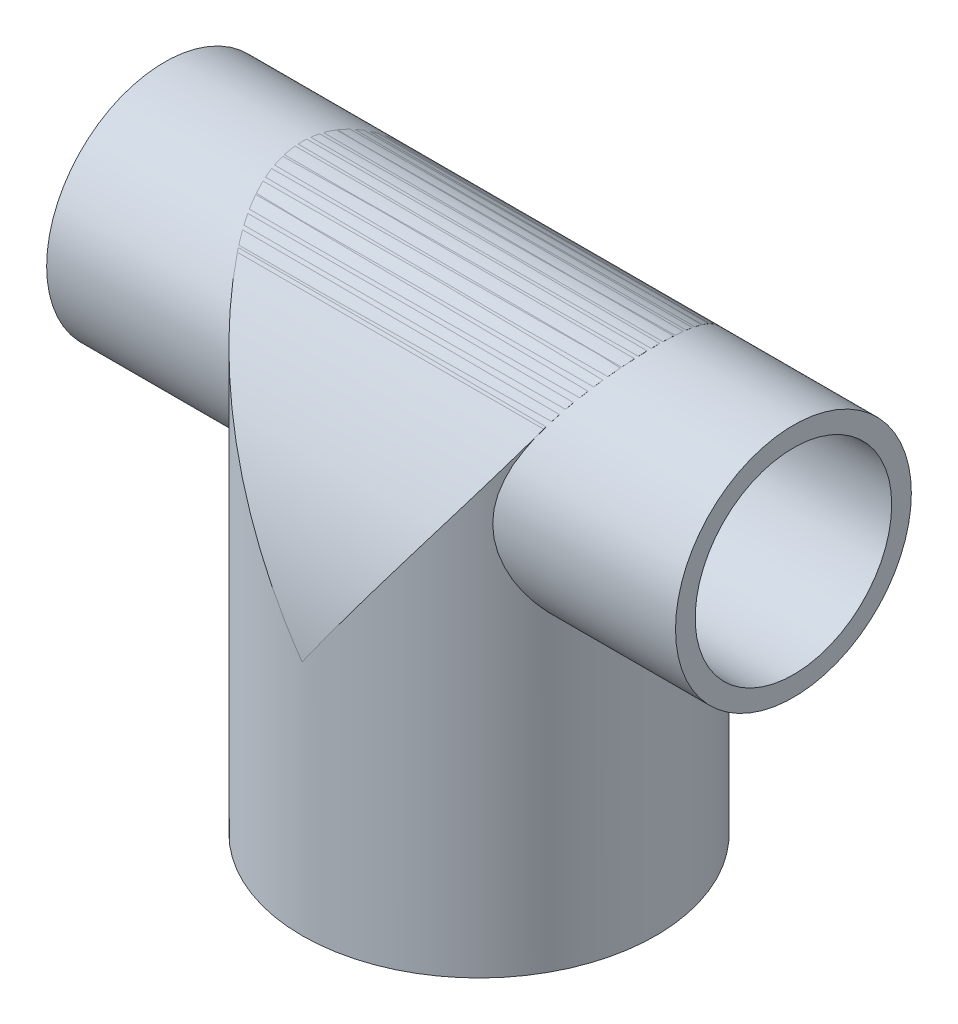
ISO-10303-21;
HEADER;
FILE_DESCRIPTION(('STEP AP214'),'2;1');
FILE_NAME('part.step','',(''),(''),'','','');
FILE_SCHEMA(('AUTOMOTIVE_DESIGN { 1 0 10303 214 1 1 1 1 }'));
ENDSEC;
DATA;
#1=APPLICATION_CONTEXT('core data for automotive mechanical design processes');
#2=APPLICATION_PROTOCOL_DEFINITION('international standard','automotive_design',2000,#1);
#3=PRODUCT_CONTEXT('',#1,'mechanical');
#4=PRODUCT('Part','Part','',(#3));
#5=PRODUCT_RELATED_PRODUCT_CATEGORY('part','',(#4));
#6=PRODUCT_DEFINITION_FORMATION('','',#4);
#7=PRODUCT_DEFINITION_CONTEXT('part definition',#1,'design');
#8=PRODUCT_DEFINITION('design','',#6,#7);
#9=PRODUCT_DEFINITION_SHAPE('','',#8);
#10=(LENGTH_UNIT() NAMED_UNIT(*) SI_UNIT(.MILLI.,.METRE.));
#11=(NAMED_UNIT(*) PLANE_ANGLE_UNIT() SI_UNIT($,.RADIAN.));
#12=(NAMED_UNIT(*) SI_UNIT($,.STERADIAN.) SOLID_ANGLE_UNIT());
#13=UNCERTAINTY_MEASURE_WITH_UNIT(LENGTH_MEASURE(1.E-05),#10,'distance_accuracy_value','');
#14=(GEOMETRIC_REPRESENTATION_CONTEXT(3) GLOBAL_UNCERTAINTY_ASSIGNED_CONTEXT((#13)) GLOBAL_UNIT_ASSIGNED_CONTEXT((#10,
#11,#12)) REPRESENTATION_CONTEXT('',''));
#15=CARTESIAN_POINT('',(0.,0.,0.));
#16=DIRECTION('',(0.,0.,1.));
#17=DIRECTION('',(1.,0.,0.));
#18=AXIS2_PLACEMENT_3D('',#15,#16,#17);
#19=CARTESIAN_POINT('',(0.,-20.,0.));
#20=DIRECTION('',(0.,1.,0.));
#21=DIRECTION('',(0.,0.,1.));
#22=AXIS2_PLACEMENT_3D('',#19,#20,#21);
#23=CYLINDRICAL_SURFACE('',#22,9.);
#24=CARTESIAN_POINT('',(-7.79422863405995,3.96862696659689,4.5));
#25=CARTESIAN_POINT('',(-7.70308478184273,3.78964083789323,4.65784763940967));
#26=CARTESIAN_POINT('',(-7.60819275088141,3.60863949449058,4.8111511341147));
#27=CARTESIAN_POINT('',(-7.41164547929331,3.24302832958497,5.10875105911939));
#28=CARTESIAN_POINT('',(-7.30999202475322,3.05841947006575,5.25304984871991));
#29=CARTESIAN_POINT('',(-6.9962917563528,2.50034413699761,5.67217649545327));
#30=CARTESIAN_POINT('',(-6.77517067294804,2.12197968729555,5.93380384000888));
#31=CARTESIAN_POINT('',(-6.31420796583351,1.35602069142892,6.42209221595486));
#32=CARTESIAN_POINT('',(-6.07441093807441,0.968449581207782,6.6488329167972));
#33=CARTESIAN_POINT('',(-5.5793677589183,0.185101532789707,7.06938278733877));
#34=CARTESIAN_POINT('',(-5.32411238146085,-0.210680211285928,7.26317202250611));
#35=CARTESIAN_POINT('',(-4.67498984183713,-1.20164067522943,7.70484117242372));
#36=CARTESIAN_POINT('',(-4.27381182104502,-1.80064353028685,7.93352666621431));
#37=CARTESIAN_POINT('',(-3.45318694729272,-3.00811989259021,8.32357916668871));
#38=CARTESIAN_POINT('',(-3.03373135366311,-3.61659783959887,8.48491356585856));
#39=CARTESIAN_POINT('',(-2.18371679891725,-4.83897015241524,8.74233911157039));
#40=CARTESIAN_POINT('',(-1.75316340915755,-5.45286170241634,8.83846235809987));
#41=CARTESIAN_POINT('',(-0.886838404548188,-6.68304899013658,8.96688489209103));
#42=CARTESIAN_POINT('',(-0.451071421129557,-7.29934230733734,8.99923712687785));
#43=CARTESIAN_POINT('',(-0.0103279263125402,-7.92264803923967,8.9999955528161));
#44=CARTESIAN_POINT('',(-0.00516394750381054,-7.92995100809319,8.99999999713518));
#45=CARTESIAN_POINT('',(0.,-7.93725393319376,9.));
#46=B_SPLINE_CURVE_WITH_KNOTS('',3,(#24,#25,#26,#27,#28,#29,#30,#31,#32,#33,#34,#35,#36,#37,#38,
#39,#40,#41,#42,#43,#44,#45),.UNSPECIFIED.,.F.,.F.,(4,2,2,2,2,2,2,2,2,2,4),(0.,
0.766200162664552,1.53219872483625,3.06142833734429,4.58711214023873,6.11371567195019,
8.37894388773574,10.645267528014,12.9104747664787,15.1738004718699,15.2006332909127),.UNSPECIFIED.);
#47=CARTESIAN_POINT('',(-7.79422863405995,3.96862696659689,4.5));
#48=VERTEX_POINT('',#47);
#49=CARTESIAN_POINT('',(0.,-7.93725393319377,9.));
#50=VERTEX_POINT('',#49);
#51=EDGE_CURVE('E12',#48,#50,#46,.T.);
#52=ORIENTED_EDGE('',*,*,#51,.F.);
#53=CARTESIAN_POINT('',(-7.79422863405995,3.96862696659689,-4.5));
#54=CARTESIAN_POINT('',(-7.85720624835063,4.09226630902378,-4.39094411568253));
#55=CARTESIAN_POINT('',(-7.92006302571594,4.21147924354131,-4.27676315758008));
#56=CARTESIAN_POINT('',(-8.04419793517149,4.44055104763342,-4.03842607130054));
#57=CARTESIAN_POINT('',(-8.10547502540107,4.55040384865153,-3.91426357153747));
#58=CARTESIAN_POINT('',(-8.22552038745858,4.76095540617064,-3.65531966868046));
#59=CARTESIAN_POINT('',(-8.28426389474949,4.86157148868968,-3.52045936362579));
#60=CARTESIAN_POINT('',(-8.39734096921317,5.05185076776169,-3.24149739214426));
#61=CARTESIAN_POINT('',(-8.45167529663421,5.14151585388117,-3.09739732657684));
#62=CARTESIAN_POINT('',(-8.55488437170934,5.30946839804961,-2.79979936468952));
#63=CARTESIAN_POINT('',(-8.60373082601114,5.38769746844698,-2.64625856353577));
#64=CARTESIAN_POINT('',(-8.69436506173527,5.5312823987743,-2.33127884590908));
#65=CARTESIAN_POINT('',(-8.73615391478504,5.5966402133288,-2.16984113331403));
#66=CARTESIAN_POINT('',(-8.81135834604909,5.71331940498058,-1.8407465853741));
#67=CARTESIAN_POINT('',(-8.8448033638281,5.76469019289492,-1.6731140824643));
#68=CARTESIAN_POINT('',(-8.90248478997426,5.85280681862831,-1.33250784882246));
#69=CARTESIAN_POINT('',(-8.92672296673541,5.88955546504379,-1.15953515071097));
#70=CARTESIAN_POINT('',(-8.96279916336987,5.9440834829961,-0.831815483785537));
#71=CARTESIAN_POINT('',(-8.97580877882574,5.9636602752428,-0.677494171556073));
#72=CARTESIAN_POINT('',(-8.99384124369654,5.99076660066649,-0.367339820269218));
#73=CARTESIAN_POINT('',(-8.99886501352125,5.99829752219264,-0.211506957509016));
#74=CARTESIAN_POINT('',(-9.00079188029445,6.00118781238094,0.100368712490278));
#75=CARTESIAN_POINT('',(-8.99769241670256,5.99654334321413,0.256411570427283));
#76=CARTESIAN_POINT('',(-8.98345091385571,5.97515308937345,0.567290151194097));
#77=CARTESIAN_POINT('',(-8.97230920336609,5.95840779937856,0.722125923107798));
#78=CARTESIAN_POINT('',(-8.94371156764752,5.91525227149708,1.0146564882198));
#79=CARTESIAN_POINT('',(-8.92695739639906,5.88991338635173,1.15258031259108));
#80=CARTESIAN_POINT('',(-8.88745525639539,5.8298689565016,1.42553951368094));
#81=CARTESIAN_POINT('',(-8.86470543196762,5.79516051180921,1.56057398212119));
#82=CARTESIAN_POINT('',(-8.81367202270314,5.71679107899152,1.82689861193669));
#83=CARTESIAN_POINT('',(-8.78539011218707,5.67313279939856,1.95818989247033));
#84=CARTESIAN_POINT('',(-8.72382035246472,5.5773094625274,2.21644169934645));
#85=CARTESIAN_POINT('',(-8.69053066812176,5.52514128613919,2.34340061704996));
#86=CARTESIAN_POINT('',(-8.5794327527444,5.3493301588035,2.73296909473134));
#87=CARTESIAN_POINT('',(-8.49376086728797,5.21143557721384,2.98707178127936));
#88=CARTESIAN_POINT('',(-8.3084928094465,4.90368818053309,3.46926397530255));
#89=CARTESIAN_POINT('',(-8.20889582831519,4.73383350905514,3.69735197048987));
#90=CARTESIAN_POINT('',(-8.05492071951331,4.45952065932751,4.01645469403522));
#91=CARTESIAN_POINT('',(-8.00330302627901,4.36573037750711,4.11819191160167));
#92=CARTESIAN_POINT('',(-7.89922896139859,4.17186435777096,4.31445159073895));
#93=CARTESIAN_POINT('',(-7.84677505534669,4.07180520434809,4.40899173562268));
#94=CARTESIAN_POINT('',(-7.79422863405995,3.96862696659688,4.5));
#95=B_SPLINE_CURVE_WITH_KNOTS('',3,(#53,#54,#55,#56,#57,#58,#59,#60,#61,#62,#63,#64,#65,#66,#67,
#68,#69,#70,#71,#72,#73,#74,#75,#76,#77,#78,#79,#80,#81,#82,#83,#84,#85,#86,#87,#88,#89,#90,#91,
#92,#93,#94),.UNSPECIFIED.,.F.,.F.,(4,2,2,2,2,2,2,2,2,2,2,2,2,2,2,2,2,2,2,2,4),(0.,
0.529353174484164,1.05904697941437,1.59309511670587,2.12705097477453,2.66364431432439,
3.2001561040488,3.73474725974394,4.26923568243898,4.73688797112515,5.2044863565715,
5.67223215235003,6.13995882786166,6.56317661210914,6.98652553766823,7.409746531713,
7.83312299782508,8.73401279833092,9.63495494276135,10.0777486310583,10.519416684576),.UNSPECIFIED.);
#96=CARTESIAN_POINT('',(-7.79422863405995,3.96862696659689,-4.5));
#97=VERTEX_POINT('',#96);
#98=EDGE_CURVE('E167',#97,#48,#95,.T.);
#99=ORIENTED_EDGE('',*,*,#98,.F.);
#100=CARTESIAN_POINT('',(-7.79422863405995,3.96862696659689,-4.5));
#101=CARTESIAN_POINT('',(-7.70308478184274,3.78964083789323,-4.65784763940967));
#102=CARTESIAN_POINT('',(-7.60819275088142,3.60863949449059,-4.81115113411469));
#103=CARTESIAN_POINT('',(-7.41164547929332,3.24302832958499,-5.10875105911937));
#104=CARTESIAN_POINT('',(-7.30999202475323,3.05841947006576,-5.2530498487199));
#105=CARTESIAN_POINT('',(-6.99629175635282,2.50034413699764,-5.67217649545324));
#106=CARTESIAN_POINT('',(-6.77517067294806,2.12197968729559,-5.93380384000886));
#107=CARTESIAN_POINT('',(-6.31420796583353,1.35602069142895,-6.42209221595484));
#108=CARTESIAN_POINT('',(-6.07441093807443,0.96844958120781,-6.64883291679718));
#109=CARTESIAN_POINT('',(-5.57936775891832,0.185101532789719,-7.06938278733876));
#110=CARTESIAN_POINT('',(-5.32411238146086,-0.210680211285922,-7.2631720225061));
#111=CARTESIAN_POINT('',(-4.67498984183713,-1.20164067522944,-7.70484117242372));
#112=CARTESIAN_POINT('',(-4.27381182104501,-1.80064353028686,-7.93352666621431));
#113=CARTESIAN_POINT('',(-3.45318694729271,-3.00811989259024,-8.32357916668872));
#114=CARTESIAN_POINT('',(-3.03373135366311,-3.61659783959892,-8.48491356585857));
#115=CARTESIAN_POINT('',(-2.18371679891721,-4.83897015241526,-8.74233911157039));
#116=CARTESIAN_POINT('',(-1.75316340915745,-5.45286170241631,-8.83846235809986));
#117=CARTESIAN_POINT('',(-0.886838404548296,-6.6830489901367,-8.96688489209104));
#118=CARTESIAN_POINT('',(-0.45107142112994,-7.29934230733765,-8.9992371268779));
#119=CARTESIAN_POINT('',(-0.0103279263125396,-7.92264803923969,-8.9999955528161));
#120=CARTESIAN_POINT('',(-0.00516394750381026,-7.9299510080932,-8.99999999713518));
#121=CARTESIAN_POINT('',(0.,-7.93725393319376,-9.));
#122=B_SPLINE_CURVE_WITH_KNOTS('',3,(#100,#101,#102,#103,#104,#105,#106,#107,#108,#109,#110,
#111,#112,#113,#114,#115,#116,#117,#118,#119,#120,#121),.UNSPECIFIED.,.F.,.F.,(4,2,2,2,2,2,2,2,
2,2,4),(0.,0.766200162664536,1.53219872483622,3.06142833734423,4.5871121402387,6.11371567195019,
8.37894388773576,10.645267528014,12.9104747664787,15.17380047187,15.2006332909127),.UNSPECIFIED.);
#123=CARTESIAN_POINT('',(0.,-7.93725393319376,-9.));
#124=VERTEX_POINT('',#123);
#125=EDGE_CURVE('E91',#124,#97,#122,.F.);
#126=ORIENTED_EDGE('',*,*,#125,.F.);
#127=CARTESIAN_POINT('',(7.79422863405995,3.96862696659689,-4.5));
#128=CARTESIAN_POINT('',(7.70308478184275,3.78964083789325,-4.65784763940965));
#129=CARTESIAN_POINT('',(7.60819275088144,3.60863949449063,-4.81115113411466));
#130=CARTESIAN_POINT('',(7.41164547929336,3.24302832958506,-5.10875105911931));
#131=CARTESIAN_POINT('',(7.30999202475328,3.05841947006586,-5.25304984871982));
#132=CARTESIAN_POINT('',(6.9962917563529,2.50034413699779,-5.67217649545314));
#133=CARTESIAN_POINT('',(6.77517067294816,2.12197968729577,-5.93380384000874));
#134=CARTESIAN_POINT('',(6.31420796583363,1.35602069142913,-6.42209221595474));
#135=CARTESIAN_POINT('',(6.07441093807451,0.968449581207951,-6.6488329167971));
#136=CARTESIAN_POINT('',(5.57936775891836,0.185101532789789,-7.06938278733873));
#137=CARTESIAN_POINT('',(5.32411238146089,-0.21068021128589,-7.26317202250609));
#138=CARTESIAN_POINT('',(4.67498984183711,-1.20164067522943,-7.70484117242372));
#139=CARTESIAN_POINT('',(4.27381182104495,-1.80064353028682,-7.93352666621431));
#140=CARTESIAN_POINT('',(3.45318694729276,-3.00811989259031,-8.32357916668873));
#141=CARTESIAN_POINT('',(3.03373135366332,-3.61659783959912,-8.48491356585858));
#142=CARTESIAN_POINT('',(2.18371679891694,-4.83897015241514,-8.7423391115704));
#143=CARTESIAN_POINT('',(1.75316340915654,-5.45286170241573,-8.83846235809987));
#144=CARTESIAN_POINT('',(0.886838404549149,-6.68304899013733,-8.96688489209104));
#145=CARTESIAN_POINT('',(0.45107142113318,-7.29934230733995,-8.9992371268779));
#146=CARTESIAN_POINT('',(0.0103279263126181,-7.92264803923975,-8.9999955528161));
#147=CARTESIAN_POINT('',(0.00516394750384992,-7.92995100809323,-8.99999999713518));
#148=CARTESIAN_POINT('',(0.,-7.93725393319376,-9.));
#149=B_SPLINE_CURVE_WITH_KNOTS('',3,(#127,#128,#129,#130,#131,#132,#133,#134,#135,#136,#137,
#138,#139,#140,#141,#142,#143,#144,#145,#146,#147,#148),.UNSPECIFIED.,.F.,.F.,(4,2,2,2,2,2,2,2,
2,2,4),(0.,0.766200162664459,1.53219872483606,3.06142833734396,4.58711214023857,
6.11371567195019,8.37894388773578,10.6452675280141,12.9104747664787,15.17380047187,
15.2006332909127),.UNSPECIFIED.);
#150=CARTESIAN_POINT('',(7.79422863405995,3.96862696659689,-4.5));
#151=VERTEX_POINT('',#150);
#152=EDGE_CURVE('E64',#151,#124,#149,.T.);
#153=ORIENTED_EDGE('',*,*,#152,.F.);
#154=CARTESIAN_POINT('',(7.79422863405995,3.96862696659688,4.5));
#155=CARTESIAN_POINT('',(7.85720624835063,4.09226630902378,4.39094411568253));
#156=CARTESIAN_POINT('',(7.92006302571594,4.21147924354131,4.27676315758007));
#157=CARTESIAN_POINT('',(8.04419793517149,4.44055104763342,4.03842607130054));
#158=CARTESIAN_POINT('',(8.10547502540107,4.55040384865153,3.91426357153747));
#159=CARTESIAN_POINT('',(8.22552038745858,4.76095540617064,3.65531966868046));
#160=CARTESIAN_POINT('',(8.28426389474949,4.86157148868968,3.52045936362579));
#161=CARTESIAN_POINT('',(8.39734096921317,5.05185076776169,3.24149739214426));
#162=CARTESIAN_POINT('',(8.45167529663421,5.14151585388117,3.09739732657684));
#163=CARTESIAN_POINT('',(8.55488437170934,5.30946839804961,2.79979936468952));
#164=CARTESIAN_POINT('',(8.60373082601114,5.38769746844698,2.64625856353577));
#165=CARTESIAN_POINT('',(8.69436506173527,5.5312823987743,2.33127884590908));
#166=CARTESIAN_POINT('',(8.73615391478504,5.5966402133288,2.16984113331403));
#167=CARTESIAN_POINT('',(8.81135834604909,5.71331940498058,1.8407465853741));
#168=CARTESIAN_POINT('',(8.8448033638281,5.76469019289492,1.6731140824643));
#169=CARTESIAN_POINT('',(8.90248478997426,5.85280681862831,1.33250784882246));
#170=CARTESIAN_POINT('',(8.92672296673541,5.88955546504379,1.15953515071097));
#171=CARTESIAN_POINT('',(8.96279916336987,5.9440834829961,0.831815483785539));
#172=CARTESIAN_POINT('',(8.97580877882574,5.9636602752428,0.677494171556075));
#173=CARTESIAN_POINT('',(8.99384124369654,5.99076660066649,0.367339820269219));
#174=CARTESIAN_POINT('',(8.99886501352125,5.99829752219265,0.211506957509017));
#175=CARTESIAN_POINT('',(9.00079188029445,6.00118781238094,-0.100368712490277));
#176=CARTESIAN_POINT('',(8.99769241670256,5.99654334321413,-0.256411570427282));
#177=CARTESIAN_POINT('',(8.98345091385571,5.97515308937345,-0.567290151194096));
#178=CARTESIAN_POINT('',(8.97230920336609,5.95840779937856,-0.722125923107797));
#179=CARTESIAN_POINT('',(8.94371156764752,5.91525227149708,-1.0146564882198));
#180=CARTESIAN_POINT('',(8.92695739639906,5.88991338635173,-1.15258031259108));
#181=CARTESIAN_POINT('',(8.88745525639539,5.8298689565016,-1.42553951368094));
#182=CARTESIAN_POINT('',(8.86470543196762,5.79516051180921,-1.56057398212119));
#183=CARTESIAN_POINT('',(8.81367202270314,5.71679107899152,-1.82689861193669));
#184=CARTESIAN_POINT('',(8.78539011218707,5.67313279939856,-1.95818989247032));
#185=CARTESIAN_POINT('',(8.72382035246472,5.5773094625274,-2.21644169934645));
#186=CARTESIAN_POINT('',(8.69053066812176,5.5251412861392,-2.34340061704996));
#187=CARTESIAN_POINT('',(8.5794327527444,5.3493301588035,-2.73296909473133));
#188=CARTESIAN_POINT('',(8.49376086728797,5.21143557721384,-2.98707178127936));
#189=CARTESIAN_POINT('',(8.3084928094465,4.90368818053309,-3.46926397530254));
#190=CARTESIAN_POINT('',(8.20889582831519,4.73383350905514,-3.69735197048987));
#191=CARTESIAN_POINT('',(8.05492071951331,4.45952065932752,-4.01645469403522));
#192=CARTESIAN_POINT('',(8.00330302627902,4.36573037750711,-4.11819191160167));
#193=CARTESIAN_POINT('',(7.89922896139859,4.17186435777096,-4.31445159073895));
#194=CARTESIAN_POINT('',(7.8467750553467,4.0718052043481,-4.40899173562267));
#195=CARTESIAN_POINT('',(7.79422863405995,3.96862696659689,-4.5));
#196=B_SPLINE_CURVE_WITH_KNOTS('',3,(#154,#155,#156,#157,#158,#159,#160,#161,#162,#163,#164,
#165,#166,#167,#168,#169,#170,#171,#172,#173,#174,#175,#176,#177,#178,#179,#180,#181,#182,#183,
#184,#185,#186,#187,#188,#189,#190,#191,#192,#193,#194,#195),.UNSPECIFIED.,.F.,.F.,(4,2,2,2,2,2,
2,2,2,2,2,2,2,2,2,2,2,2,2,2,4),(0.,0.529353174484164,1.05904697941437,1.59309511670587,
2.12705097477453,2.66364431432438,3.2001561040488,3.73474725974394,4.26923568243898,
4.73688797112515,5.2044863565715,5.67223215235003,6.13995882786166,6.56317661210914,
6.98652553766823,7.40974653171299,7.83312299782508,8.73401279833092,9.63495494276135,
10.0777486310583,10.519416684576),.UNSPECIFIED.);
#197=CARTESIAN_POINT('',(7.79422863405995,3.96862696659689,4.5));
#198=VERTEX_POINT('',#197);
#199=EDGE_CURVE('E72',#198,#151,#196,.T.);
#200=ORIENTED_EDGE('',*,*,#199,.F.);
#201=CARTESIAN_POINT('',(7.79422863405995,3.96862696659689,4.5));
#202=CARTESIAN_POINT('',(7.70308478184266,3.78964083789309,4.6578476394098));
#203=CARTESIAN_POINT('',(7.60819275088127,3.6086394944903,4.81115113411494));
#204=CARTESIAN_POINT('',(7.411645479293,3.24302832958439,5.10875105911985));
#205=CARTESIAN_POINT('',(7.30999202475281,3.05841947006501,5.25304984872048));
#206=CARTESIAN_POINT('',(6.99629175635216,2.50034413699649,5.67217649545408));
#207=CARTESIAN_POINT('',(6.77517067294722,2.12197968729419,5.93380384000982));
#208=CARTESIAN_POINT('',(6.31420796583267,1.35602069142756,6.42209221595567));
#209=CARTESIAN_POINT('',(6.07441093807376,0.968449581206702,6.6488329167978));
#210=CARTESIAN_POINT('',(5.57936775891795,0.185101532789199,7.06938278733902));
#211=CARTESIAN_POINT('',(5.32411238146061,-0.210680211286138,7.26317202250622));
#212=CARTESIAN_POINT('',(4.67498984183727,-1.20164067522947,7.7048411724237));
#213=CARTESIAN_POINT('',(4.27381182104557,-1.80064353028712,7.93352666621428));
#214=CARTESIAN_POINT('',(3.45318694729238,-3.00811989258963,8.32357916668865));
#215=CARTESIAN_POINT('',(3.03373135366149,-3.61659783959721,8.48491356585847));
#216=CARTESIAN_POINT('',(2.18371679891939,-4.83897015241616,8.74233911157032));
#217=CARTESIAN_POINT('',(1.75316340916473,-5.45286170242092,8.83846235809983));
#218=CARTESIAN_POINT('',(0.886838404541415,-6.68304899013154,8.96688489209102));
#219=CARTESIAN_POINT('',(0.451071421103808,-7.29934230731903,8.99923712687785));
#220=CARTESIAN_POINT('',(0.0103279263119171,-7.92264803923926,8.9999955528161));
#221=CARTESIAN_POINT('',(0.00516394750349585,-7.92995100809299,8.99999999713518));
#222=CARTESIAN_POINT('',(0.,-7.93725393319376,9.));
#223=B_SPLINE_CURVE_WITH_KNOTS('',3,(#201,#202,#203,#204,#205,#206,#207,#208,#209,#210,#211,
#212,#213,#214,#215,#216,#217,#218,#219,#220,#221,#222),.UNSPECIFIED.,.F.,.F.,(4,2,2,2,2,2,2,2,
2,2,4),(0.,0.766200162665161,1.53219872483747,3.06142833734646,4.58711214023974,
6.11371567195019,8.37894388773559,10.6452675280134,12.9104747664783,15.17380047187,
15.2006332909127),.UNSPECIFIED.);
#224=EDGE_CURVE('E57',#50,#198,#223,.F.);
#225=ORIENTED_EDGE('',*,*,#224,.F.);
#226=EDGE_LOOP('',(#52,#99,#126,#153,#200,#225));
#227=FACE_BOUND('',#226,.T.);
#228=CARTESIAN_POINT('',(-7.48331477354788,0.,-5.));
#229=CARTESIAN_POINT('',(-7.48331243270644,-0.127928170715056,-5.00000168612793));
#230=CARTESIAN_POINT('',(-7.48660574987456,-0.255838132301188,-4.99508455829408));
#231=CARTESIAN_POINT('',(-7.49963659714171,-0.510621042767456,-4.97549919253991));
#232=CARTESIAN_POINT('',(-7.50937612609855,-0.637493657627068,-4.96082793002622));
#233=CARTESIAN_POINT('',(-7.53492756878942,-0.889291751976052,-4.9219311144111));
#234=CARTESIAN_POINT('',(-7.55074649531046,-1.01421480876389,-4.89769452651612));
#235=CARTESIAN_POINT('',(-7.58784959281151,-1.26110748502085,-4.84001097740078));
#236=CARTESIAN_POINT('',(-7.60913621855172,-1.38307575093169,-4.80655987877434));
#237=CARTESIAN_POINT('',(-7.6797857418344,-1.74173874748067,-4.69348469782986));
#238=CARTESIAN_POINT('',(-7.7361492848583,-1.97308729480385,-4.6008376898236));
#239=CARTESIAN_POINT('',(-7.8609828997943,-2.41673416977655,-4.3841201609423));
#240=CARTESIAN_POINT('',(-7.92945565972793,-2.62902825188186,-4.26004266043126));
#241=CARTESIAN_POINT('',(-8.07938439169733,-3.05281452486914,-3.96900941703642));
#242=CARTESIAN_POINT('',(-8.16145087575439,-3.26195895536872,-3.79894853966482));
#243=CARTESIAN_POINT('',(-8.32445651504933,-3.65072087878831,-3.42703633826428));
#244=CARTESIAN_POINT('',(-8.40539495238046,-3.83032028975136,-3.22516569308146));
#245=CARTESIAN_POINT('',(-8.5237245436681,-4.08166010192059,-2.89167020747027));
#246=CARTESIAN_POINT('',(-8.56416494780395,-4.16527912122501,-2.76990775893002));
#247=CARTESIAN_POINT('',(-8.64139626557983,-4.32184858251394,-2.51863299992486));
#248=CARTESIAN_POINT('',(-8.67818866514922,-4.39480337411307,-2.38912387963632));
#249=CARTESIAN_POINT('',(-8.74706012051628,-4.52928174685992,-2.12315988404788));
#250=CARTESIAN_POINT('',(-8.77914083555733,-4.59080935417706,-1.98670747676404));
#251=CARTESIAN_POINT('',(-8.83763516885212,-4.70170358844203,-1.70777533063703));
#252=CARTESIAN_POINT('',(-8.86404955947242,-4.75107187294153,-1.56529641642995));
#253=CARTESIAN_POINT('',(-8.9084121929235,-4.83331159601496,-1.2877293286113));
#254=CARTESIAN_POINT('',(-8.92688709925996,-4.86722427041803,-1.15303346970813));
#255=CARTESIAN_POINT('',(-8.95786090893053,-4.9238028113414,-0.880630387921038));
#256=CARTESIAN_POINT('',(-8.97036055664496,-4.94647007879502,-0.742923542373393));
#257=CARTESIAN_POINT('',(-8.98901292475149,-4.98021596584801,-0.465755150646476));
#258=CARTESIAN_POINT('',(-8.99516954559615,-4.99130170721546,-0.326294736245329));
#259=CARTESIAN_POINT('',(-9.00096328235762,-5.00173570696184,-0.0468047673154426));
#260=CARTESIAN_POINT('',(-9.00060092929895,-5.00108492137826,0.0932247399269451));
#261=CARTESIAN_POINT('',(-8.99375897306589,-4.98875939584325,0.357589375165987));
#262=CARTESIAN_POINT('',(-8.98793869928273,-4.97827281423195,0.481999139387702));
#263=CARTESIAN_POINT('',(-8.97125208146431,-4.94808268510851,0.729391178571269));
#264=CARTESIAN_POINT('',(-8.96038417831597,-4.92837628976411,0.852373000430963));
#265=CARTESIAN_POINT('',(-8.933857624232,-4.87998186460896,1.0959879317887));
#266=CARTESIAN_POINT('',(-8.91820058390017,-4.85129685426278,1.21662181642146));
#267=CARTESIAN_POINT('',(-8.88245387233265,-4.78526368688044,1.45483863725785));
#268=CARTESIAN_POINT('',(-8.86236249112146,-4.74791218757739,1.57242037688768));
#269=CARTESIAN_POINT('',(-8.79562517969764,-4.62256700082792,1.92181762983687));
#270=CARTESIAN_POINT('',(-8.74277577170476,-4.52174175779678,2.1480017049967));
#271=CARTESIAN_POINT('',(-8.62503641093523,-4.28966562099262,2.58053930802783));
#272=CARTESIAN_POINT('',(-8.56014267731539,-4.15840517004661,2.78688657795254));
#273=CARTESIAN_POINT('',(-8.41570683408599,-3.8528159261413,3.19818054768561));
#274=CARTESIAN_POINT('',(-8.33533893661063,-3.67534870661192,3.40051176015554));
#275=CARTESIAN_POINT('',(-8.17300182627649,-3.29066269952502,3.77407432303871));
#276=CARTESIAN_POINT('',(-8.09103100070489,-3.08341245931567,3.94527235640164));
#277=CARTESIAN_POINT('',(-7.92624804992578,-2.62215879946026,4.26734084912913));
#278=CARTESIAN_POINT('',(-7.84403433178347,-2.36561956008623,4.41495784404018));
#279=CARTESIAN_POINT('',(-7.73498351899427,-1.96133795588162,4.60165722327992));
#280=CARTESIAN_POINT('',(-7.70100676332582,-1.82330564931293,4.658109622582));
#281=CARTESIAN_POINT('',(-7.63921059111262,-1.54155222663391,4.7587758249449));
#282=CARTESIAN_POINT('',(-7.61138696341208,-1.39783508109271,4.80299800350574));
#283=CARTESIAN_POINT('',(-7.5651320096596,-1.11748986552016,4.87549794974713));
#284=CARTESIAN_POINT('',(-7.54612808373361,-0.981212168446139,4.90476696847616));
#285=CARTESIAN_POINT('',(-7.51529770745305,-0.705959092403591,4.95187815824222));
#286=CARTESIAN_POINT('',(-7.50346703130621,-0.566985351585586,4.96972705726391));
#287=CARTESIAN_POINT('',(-7.48754609042981,-0.287692617575571,4.99368227791014));
#288=CARTESIAN_POINT('',(-7.48344985429394,-0.147374746322157,4.99979765850493));
#289=CARTESIAN_POINT('',(-7.48318633493304,0.133275216040528,5.00019240169459));
#290=CARTESIAN_POINT('',(-7.48701814133072,0.273607303667007,4.99447312326359));
#291=CARTESIAN_POINT('',(-7.50125622905865,0.531875664939579,4.97305608418911));
#292=CARTESIAN_POINT('',(-7.5105887458667,0.650010320230788,4.95898586540265));
#293=CARTESIAN_POINT('',(-7.534498129646,0.884473013879259,4.92258085796589));
#294=CARTESIAN_POINT('',(-7.54907658379326,1.00080049434618,4.90024356802701));
#295=CARTESIAN_POINT('',(-7.59999895162263,1.34595183023731,4.82120532084329));
#296=CARTESIAN_POINT('',(-7.64353818677589,1.57107992342602,4.75246638801692));
#297=CARTESIAN_POINT('',(-7.74683834475778,2.01553201450185,4.58221724529598));
#298=CARTESIAN_POINT('',(-7.80719429287902,2.2342335907062,4.47947225804339));
#299=CARTESIAN_POINT('',(-7.93705962571136,2.65263979276304,4.24511762030607));
#300=CARTESIAN_POINT('',(-8.00657347173436,2.85233507741527,4.11349388047475));
#301=CARTESIAN_POINT('',(-8.16042346556685,3.26097955461948,3.80034784976049));
#302=CARTESIAN_POINT('',(-8.2453341921284,3.46617045049335,3.61419416643233));
#303=CARTESIAN_POINT('',(-8.41116341865886,3.8440219318929,3.20937434365972));
#304=CARTESIAN_POINT('',(-8.49207942899203,4.01666241525602,2.99068826132987));
#305=CARTESIAN_POINT('',(-8.60654459047302,4.25177528884976,2.63516774990157));
#306=CARTESIAN_POINT('',(-8.64441160092823,4.3277627198003,2.50847277030253));
#307=CARTESIAN_POINT('',(-8.71579527343903,4.46864465542428,2.24791423169751));
#308=CARTESIAN_POINT('',(-8.74931387896152,4.53354411986924,2.11405391320455));
#309=CARTESIAN_POINT('',(-8.81099820555219,4.65147414261944,1.84011344990816));
#310=CARTESIAN_POINT('',(-8.83916713100797,4.70451180938823,1.70003709086338));
#311=CARTESIAN_POINT('',(-8.88929967030502,4.7980423274824,1.41468037296527));
#312=CARTESIAN_POINT('',(-8.91126422653184,4.83853708404859,1.26940080821145));
#313=CARTESIAN_POINT('',(-8.94636750970623,4.90287043625824,0.990072404677545));
#314=CARTESIAN_POINT('',(-8.96018108298178,4.92799270336154,0.856402908403519));
#315=CARTESIAN_POINT('',(-8.98185367551306,4.96728957025403,0.586991953267881));
#316=CARTESIAN_POINT('',(-8.98971334870683,4.98146537233577,0.451250723623285));
#317=CARTESIAN_POINT('',(-8.99925276317403,4.99865996610084,0.178906584918184));
#318=CARTESIAN_POINT('',(-9.00093522424297,5.00168366800061,0.0423040816174009));
#319=CARTESIAN_POINT('',(-8.99807967611154,4.99654304393119,-0.230619287697879));
#320=CARTESIAN_POINT('',(-8.99354199713608,4.98837931189865,-0.366940168278828));
#321=CARTESIAN_POINT('',(-8.97907835524008,4.96225300560966,-0.625569673939185));
#322=CARTESIAN_POINT('',(-8.96968964144521,4.94526668852909,-0.748008023900198));
#323=CARTESIAN_POINT('',(-8.94612300520264,4.90239002683889,-0.99085862723126));
#324=CARTESIAN_POINT('',(-8.93194359414207,4.87649691457634,-1.11127023860903));
#325=CARTESIAN_POINT('',(-8.88267195984857,4.78586534408874,-1.46820122399357));
#326=CARTESIAN_POINT('',(-8.84083292190673,4.70815134393254,-1.70064180021527));
#327=CARTESIAN_POINT('',(-8.74108400233929,4.51810507922043,-2.15633419420624));
#328=CARTESIAN_POINT('',(-8.68269129836171,4.40471936883697,-2.37903324754165));
#329=CARTESIAN_POINT('',(-8.5552586630217,4.1478778307882,-2.80296262142684));
#330=CARTESIAN_POINT('',(-8.48621453838248,4.00441015235769,-3.00418443375149));
#331=CARTESIAN_POINT('',(-8.33433239933883,3.67224716892185,-3.40438344512707));
#332=CARTESIAN_POINT('',(-8.25082429244304,3.48023099761411,-3.60037215975203));
#333=CARTESIAN_POINT('',(-8.12652435608709,3.17007268449902,-3.86903363258921));
#334=CARTESIAN_POINT('',(-8.08521168619209,3.06288246096794,-3.95443792366344));
#335=CARTESIAN_POINT('',(-8.00395385460266,2.84145897559001,-4.11642028323729));
#336=CARTESIAN_POINT('',(-7.96400893588489,2.7272244723415,-4.19299678916885));
#337=CARTESIAN_POINT('',(-7.88386707615332,2.48384412153507,-4.34192328581962));
#338=CARTESIAN_POINT('',(-7.84385429718774,2.35421559392718,-4.41358524085905));
#339=CARTESIAN_POINT('',(-7.76814653972989,2.08814528076008,-4.5455123626852));
#340=CARTESIAN_POINT('',(-7.73244939230646,1.95170696675683,-4.60578326299018));
#341=CARTESIAN_POINT('',(-7.66687445970633,1.67309306323949,-4.7141322351862));
#342=CARTESIAN_POINT('',(-7.63698299789825,1.53093193379134,-4.7622390452046));
#343=CARTESIAN_POINT('',(-7.58430305235848,1.24171103409555,-4.84569782953676));
#344=CARTESIAN_POINT('',(-7.56151010469754,1.0946544070744,-4.88105782195096));
#345=CARTESIAN_POINT('',(-7.52341637226572,0.790827416689643,-4.93958350003765));
#346=CARTESIAN_POINT('',(-7.5084591340159,0.633905510712645,-4.96219291852393));
#347=CARTESIAN_POINT('',(-7.48841004941367,0.317979622880837,-4.99239972476833));
#348=CARTESIAN_POINT('',(-7.48331768250081,0.158975751335293,-4.99999790465655));
#349=CARTESIAN_POINT('',(-7.48331477354788,0.,-5.));
#350=B_SPLINE_CURVE_WITH_KNOTS('',3,(#228,#229,#230,#231,#232,#233,#234,#235,#236,#237,#238,
#239,#240,#241,#242,#243,#244,#245,#246,#247,#248,#249,#250,#251,#252,#253,#254,#255,#256,#257,
#258,#259,#260,#261,#262,#263,#264,#265,#266,#267,#268,#269,#270,#271,#272,#273,#274,#275,#276,
#277,#278,#279,#280,#281,#282,#283,#284,#285,#286,#287,#288,#289,#290,#291,#292,#293,#294,#295,
#296,#297,#298,#299,#300,#301,#302,#303,#304,#305,#306,#307,#308,#309,#310,#311,#312,#313,#314,
#315,#316,#317,#318,#319,#320,#321,#322,#323,#324,#325,#326,#327,#328,#329,#330,#331,#332,#333,
#334,#335,#336,#337,#338,#339,#340,#341,#342,#343,#344,#345,#346,#347,#348,#349),.UNSPECIFIED.,
.T.,.F.,(4,2,2,2,2,2,2,2,2,2,2,2,2,2,2,2,2,2,2,2,2,2,2,2,2,2,2,2,2,2,2,2,2,2,2,2,2,2,2,2,2,2,2,
2,2,2,2,2,2,2,2,2,2,2,2,2,2,2,2,2,4),(0.,0.383617262434558,0.767353533654934,1.15153379253867,
1.53588683411637,2.29887381256895,3.06203037306044,3.90401345702823,4.74650994436255,
5.20543330239272,5.66416895408678,6.12274267036476,6.58125383950372,7.00103463233332,
7.42076311645812,7.84023334691958,8.25966940820447,8.63418281341922,9.00881197544208,
9.3833152866135,9.75796326728325,10.5142082489873,11.2706910268593,12.1098131090736,
12.9498279570035,13.8660549484084,14.3243316832876,14.782293799555,15.2036849882509,
15.6248276917814,16.0456451171919,16.4664142228104,16.8239929217894,17.1816798984961,
17.8966505229979,18.6411117273933,19.3859369498883,20.2516469645331,21.1178898770868,
21.5748932590507,22.0316916800075,22.4882156157593,22.9446701724715,23.3542362432265,
23.7637573233568,24.1730980717718,24.5824170892821,24.9538736149232,25.3254456695292,
26.0679180989854,26.834783232574,27.6019510415397,28.4584307032009,28.8875063562193,
29.3166578418249,29.7763339243287,30.2357780158996,30.6941262921722,31.1521857495434,
31.6289303211718,32.105649734729),.UNSPECIFIED.);
#351=CARTESIAN_POINT('',(-7.48331477354788,0.,-5.));
#352=VERTEX_POINT('',#351);
#353=EDGE_CURVE('E120',#352,#352,#350,.T.);
#354=ORIENTED_EDGE('',*,*,#353,.F.);
#355=EDGE_LOOP('',(#354));
#356=FACE_BOUND('',#355,.T.);
#357=CARTESIAN_POINT('',(7.48331477354789,0.,-5.));
#358=CARTESIAN_POINT('',(7.48331243270645,0.127928170715056,-5.00000168612793));
#359=CARTESIAN_POINT('',(7.48660574987457,0.255838132301188,-4.99508455829408));
#360=CARTESIAN_POINT('',(7.49963659714171,0.510621042767456,-4.97549919253991));
#361=CARTESIAN_POINT('',(7.50937612609855,0.637493657627068,-4.96082793002622));
#362=CARTESIAN_POINT('',(7.53492756878942,0.889291751976052,-4.9219311144111));
#363=CARTESIAN_POINT('',(7.55074649531046,1.01421480876389,-4.89769452651612));
#364=CARTESIAN_POINT('',(7.58784959281151,1.26110748502085,-4.84001097740078));
#365=CARTESIAN_POINT('',(7.60913621855172,1.38307575093169,-4.80655987877434));
#366=CARTESIAN_POINT('',(7.6797857418344,1.74173874748067,-4.69348469782986));
#367=CARTESIAN_POINT('',(7.7361492848583,1.97308729480385,-4.6008376898236));
#368=CARTESIAN_POINT('',(7.8609828997943,2.41673416977655,-4.3841201609423));
#369=CARTESIAN_POINT('',(7.92945565972793,2.62902825188186,-4.26004266043126));
#370=CARTESIAN_POINT('',(8.07938439169733,3.05281452486914,-3.96900941703643));
#371=CARTESIAN_POINT('',(8.16145087575439,3.26195895536872,-3.79894853966482));
#372=CARTESIAN_POINT('',(8.32445651504933,3.6507208787883,-3.42703633826428));
#373=CARTESIAN_POINT('',(8.40539495238046,3.83032028975136,-3.22516569308146));
#374=CARTESIAN_POINT('',(8.5237245436681,4.08166010192059,-2.89167020747027));
#375=CARTESIAN_POINT('',(8.56416494780395,4.16527912122501,-2.76990775893002));
#376=CARTESIAN_POINT('',(8.64139626557983,4.32184858251394,-2.51863299992486));
#377=CARTESIAN_POINT('',(8.67818866514921,4.39480337411306,-2.38912387963633));
#378=CARTESIAN_POINT('',(8.74706012051628,4.52928174685992,-2.12315988404788));
#379=CARTESIAN_POINT('',(8.77914083555733,4.59080935417706,-1.98670747676405));
#380=CARTESIAN_POINT('',(8.83763516885212,4.70170358844203,-1.70777533063704));
#381=CARTESIAN_POINT('',(8.86404955947242,4.75107187294153,-1.56529641642996));
#382=CARTESIAN_POINT('',(8.9084121929235,4.83331159601496,-1.2877293286113));
#383=CARTESIAN_POINT('',(8.92688709925996,4.86722427041803,-1.15303346970813));
#384=CARTESIAN_POINT('',(8.95786090893053,4.9238028113414,-0.880630387921044));
#385=CARTESIAN_POINT('',(8.97036055664496,4.94647007879502,-0.742923542373399));
#386=CARTESIAN_POINT('',(8.98901292475149,4.98021596584801,-0.465755150646482));
#387=CARTESIAN_POINT('',(8.99516954559615,4.99130170721546,-0.326294736245334));
#388=CARTESIAN_POINT('',(9.00096328235762,5.00173570696184,-0.0468047673154481));
#389=CARTESIAN_POINT('',(9.00060092929895,5.00108492137827,0.0932247399269394));
#390=CARTESIAN_POINT('',(8.99375897306589,4.98875939584325,0.357589375165981));
#391=CARTESIAN_POINT('',(8.98793869928273,4.97827281423195,0.481999139387696));
#392=CARTESIAN_POINT('',(8.97125208146431,4.94808268510851,0.729391178571263));
#393=CARTESIAN_POINT('',(8.96038417831597,4.92837628976411,0.852373000430957));
#394=CARTESIAN_POINT('',(8.933857624232,4.87998186460896,1.09598793178869));
#395=CARTESIAN_POINT('',(8.91820058390017,4.85129685426279,1.21662181642145));
#396=CARTESIAN_POINT('',(8.88245387233265,4.78526368688044,1.45483863725784));
#397=CARTESIAN_POINT('',(8.86236249112146,4.74791218757739,1.57242037688768));
#398=CARTESIAN_POINT('',(8.79562517969764,4.62256700082792,1.92181762983687));
#399=CARTESIAN_POINT('',(8.74277577170476,4.52174175779679,2.14800170499669));
#400=CARTESIAN_POINT('',(8.62503641093523,4.28966562099262,2.58053930802783));
#401=CARTESIAN_POINT('',(8.56014267731539,4.15840517004661,2.78688657795254));
#402=CARTESIAN_POINT('',(8.41570683408599,3.85281592614131,3.1981805476856));
#403=CARTESIAN_POINT('',(8.33533893661063,3.67534870661193,3.40051176015554));
#404=CARTESIAN_POINT('',(8.17300182627649,3.29066269952502,3.7740743230387));
#405=CARTESIAN_POINT('',(8.09103100070489,3.08341245931567,3.94527235640164));
#406=CARTESIAN_POINT('',(7.92624804992578,2.62215879946026,4.26734084912913));
#407=CARTESIAN_POINT('',(7.84403433178347,2.36561956008624,4.41495784404018));
#408=CARTESIAN_POINT('',(7.73498351899427,1.96133795588162,4.60165722327992));
#409=CARTESIAN_POINT('',(7.70100676332582,1.82330564931294,4.658109622582));
#410=CARTESIAN_POINT('',(7.63921059111262,1.54155222663391,4.7587758249449));
#411=CARTESIAN_POINT('',(7.61138696341208,1.39783508109271,4.80299800350574));
#412=CARTESIAN_POINT('',(7.56513200965961,1.11748986552017,4.87549794974713));
#413=CARTESIAN_POINT('',(7.54612808373361,0.981212168446145,4.90476696847616));
#414=CARTESIAN_POINT('',(7.51529770745305,0.705959092403598,4.95187815824221));
#415=CARTESIAN_POINT('',(7.50346703130621,0.566985351585592,4.96972705726391));
#416=CARTESIAN_POINT('',(7.48754609042981,0.287692617575576,4.99368227791014));
#417=CARTESIAN_POINT('',(7.48344985429394,0.147374746322161,4.99979765850493));
#418=CARTESIAN_POINT('',(7.48318633493304,-0.133275216040523,5.00019240169459));
#419=CARTESIAN_POINT('',(7.48701814133072,-0.273607303667002,4.99447312326359));
#420=CARTESIAN_POINT('',(7.50125622905865,-0.531875664939573,4.97305608418911));
#421=CARTESIAN_POINT('',(7.5105887458667,-0.650010320230783,4.95898586540265));
#422=CARTESIAN_POINT('',(7.534498129646,-0.884473013879254,4.92258085796589));
#423=CARTESIAN_POINT('',(7.54907658379326,-1.00080049434618,4.90024356802702));
#424=CARTESIAN_POINT('',(7.59999895162263,-1.3459518302373,4.8212053208433));
#425=CARTESIAN_POINT('',(7.64353818677589,-1.57107992342602,4.75246638801692));
#426=CARTESIAN_POINT('',(7.74683834475778,-2.01553201450185,4.58221724529598));
#427=CARTESIAN_POINT('',(7.80719429287902,-2.23423359070619,4.47947225804339));
#428=CARTESIAN_POINT('',(7.93705962571136,-2.65263979276304,4.24511762030607));
#429=CARTESIAN_POINT('',(8.00657347173436,-2.85233507741527,4.11349388047475));
#430=CARTESIAN_POINT('',(8.16042346556685,-3.26097955461947,3.80034784976049));
#431=CARTESIAN_POINT('',(8.2453341921284,-3.46617045049335,3.61419416643233));
#432=CARTESIAN_POINT('',(8.41116341865886,-3.8440219318929,3.20937434365972));
#433=CARTESIAN_POINT('',(8.49207942899203,-4.01666241525601,2.99068826132988));
#434=CARTESIAN_POINT('',(8.60654459047302,-4.25177528884975,2.63516774990158));
#435=CARTESIAN_POINT('',(8.64441160092823,-4.3277627198003,2.50847277030253));
#436=CARTESIAN_POINT('',(8.71579527343903,-4.46864465542428,2.24791423169751));
#437=CARTESIAN_POINT('',(8.74931387896151,-4.53354411986924,2.11405391320455));
#438=CARTESIAN_POINT('',(8.81099820555219,-4.65147414261944,1.84011344990816));
#439=CARTESIAN_POINT('',(8.83916713100797,-4.70451180938823,1.70003709086338));
#440=CARTESIAN_POINT('',(8.88929967030502,-4.79804232748239,1.41468037296527));
#441=CARTESIAN_POINT('',(8.91126422653184,-4.83853708404859,1.26940080821146));
#442=CARTESIAN_POINT('',(8.94636750970623,-4.90287043625824,0.990072404677549));
#443=CARTESIAN_POINT('',(8.96018108298178,-4.92799270336154,0.856402908403524));
#444=CARTESIAN_POINT('',(8.98185367551306,-4.96728957025403,0.586991953267887));
#445=CARTESIAN_POINT('',(8.98971334870683,-4.98146537233577,0.451250723623289));
#446=CARTESIAN_POINT('',(8.99925276317403,-4.99865996610084,0.178906584918187));
#447=CARTESIAN_POINT('',(9.00093522424297,-5.00168366800061,0.0423040816174036));
#448=CARTESIAN_POINT('',(8.99807967611154,-4.99654304393119,-0.230619287697876));
#449=CARTESIAN_POINT('',(8.99354199713608,-4.98837931189865,-0.366940168278826));
#450=CARTESIAN_POINT('',(8.97907835524008,-4.96225300560966,-0.625569673939183));
#451=CARTESIAN_POINT('',(8.96968964144521,-4.94526668852909,-0.748008023900196));
#452=CARTESIAN_POINT('',(8.94612300520264,-4.90239002683889,-0.990858627231257));
#453=CARTESIAN_POINT('',(8.93194359414207,-4.87649691457634,-1.11127023860903));
#454=CARTESIAN_POINT('',(8.88267195984857,-4.78586534408874,-1.46820122399357));
#455=CARTESIAN_POINT('',(8.84083292190673,-4.70815134393254,-1.70064180021527));
#456=CARTESIAN_POINT('',(8.74108400233929,-4.51810507922043,-2.15633419420624));
#457=CARTESIAN_POINT('',(8.68269129836171,-4.40471936883697,-2.37903324754164));
#458=CARTESIAN_POINT('',(8.5552586630217,-4.1478778307882,-2.80296262142683));
#459=CARTESIAN_POINT('',(8.48621453838248,-4.00441015235769,-3.00418443375149));
#460=CARTESIAN_POINT('',(8.33433239933884,-3.67224716892185,-3.40438344512707));
#461=CARTESIAN_POINT('',(8.25082429244304,-3.48023099761411,-3.60037215975202));
#462=CARTESIAN_POINT('',(8.12652435608709,-3.17007268449902,-3.86903363258921));
#463=CARTESIAN_POINT('',(8.08521168619209,-3.06288246096794,-3.95443792366344));
#464=CARTESIAN_POINT('',(8.00395385460267,-2.84145897559001,-4.11642028323729));
#465=CARTESIAN_POINT('',(7.96400893588489,-2.7272244723415,-4.19299678916885));
#466=CARTESIAN_POINT('',(7.88386707615332,-2.48384412153507,-4.34192328581962));
#467=CARTESIAN_POINT('',(7.84385429718774,-2.35421559392718,-4.41358524085905));
#468=CARTESIAN_POINT('',(7.76814653972989,-2.08814528076008,-4.5455123626852));
#469=CARTESIAN_POINT('',(7.73244939230646,-1.95170696675683,-4.60578326299018));
#470=CARTESIAN_POINT('',(7.66687445970633,-1.67309306323949,-4.7141322351862));
#471=CARTESIAN_POINT('',(7.63698299789825,-1.53093193379134,-4.7622390452046));
#472=CARTESIAN_POINT('',(7.58430305235848,-1.24171103409555,-4.84569782953676));
#473=CARTESIAN_POINT('',(7.56151010469754,-1.0946544070744,-4.88105782195096));
#474=CARTESIAN_POINT('',(7.52341637226572,-0.790827416689645,-4.93958350003765));
#475=CARTESIAN_POINT('',(7.50845913401589,-0.633905510712647,-4.96219291852393));
#476=CARTESIAN_POINT('',(7.48841004941367,-0.317979622880839,-4.99239972476833));
#477=CARTESIAN_POINT('',(7.48331768250081,-0.158975751335294,-4.99999790465655));
#478=CARTESIAN_POINT('',(7.48331477354789,0.,-5.));
#479=B_SPLINE_CURVE_WITH_KNOTS('',3,(#357,#358,#359,#360,#361,#362,#363,#364,#365,#366,#367,
#368,#369,#370,#371,#372,#373,#374,#375,#376,#377,#378,#379,#380,#381,#382,#383,#384,#385,#386,
#387,#388,#389,#390,#391,#392,#393,#394,#395,#396,#397,#398,#399,#400,#401,#402,#403,#404,#405,
#406,#407,#408,#409,#410,#411,#412,#413,#414,#415,#416,#417,#418,#419,#420,#421,#422,#423,#424,
#425,#426,#427,#428,#429,#430,#431,#432,#433,#434,#435,#436,#437,#438,#439,#440,#441,#442,#443,
#444,#445,#446,#447,#448,#449,#450,#451,#452,#453,#454,#455,#456,#457,#458,#459,#460,#461,#462,
#463,#464,#465,#466,#467,#468,#469,#470,#471,#472,#473,#474,#475,#476,#477,#478),.UNSPECIFIED.,
.T.,.F.,(4,2,2,2,2,2,2,2,2,2,2,2,2,2,2,2,2,2,2,2,2,2,2,2,2,2,2,2,2,2,2,2,2,2,2,2,2,2,2,2,2,2,2,
2,2,2,2,2,2,2,2,2,2,2,2,2,2,2,2,2,4),(0.,0.383617262434558,0.767353533654934,1.15153379253867,
1.53588683411636,2.29887381256895,3.06203037306044,3.90401345702823,4.74650994436255,
5.20543330239271,5.66416895408678,6.12274267036475,6.58125383950371,7.00103463233332,
7.42076311645811,7.84023334691958,8.25966940820446,8.63418281341921,9.00881197544207,
9.38331528661349,9.75796326728325,10.5142082489873,11.2706910268593,12.1098131090736,
12.9498279570035,13.8660549484084,14.3243316832876,14.782293799555,15.2036849882509,
15.6248276917814,16.0456451171919,16.4664142228104,16.8239929217894,17.1816798984961,
17.8966505229979,18.6411117273933,19.3859369498883,20.2516469645331,21.1178898770868,
21.5748932590507,22.0316916800074,22.4882156157593,22.9446701724715,23.3542362432264,
23.7637573233568,24.1730980717718,24.5824170892821,24.9538736149232,25.3254456695292,
26.0679180989854,26.834783232574,27.6019510415397,28.4584307032008,28.8875063562193,
29.3166578418249,29.7763339243287,30.2357780158996,30.6941262921722,31.1521857495434,
31.6289303211718,32.105649734729),.UNSPECIFIED.);
#480=CARTESIAN_POINT('',(7.48331477354789,0.,-5.));
#481=VERTEX_POINT('',#480);
#482=EDGE_CURVE('E127',#481,#481,#479,.T.);
#483=ORIENTED_EDGE('',*,*,#482,.F.);
#484=EDGE_LOOP('',(#483));
#485=FACE_BOUND('',#484,.T.);
#486=CARTESIAN_POINT('',(0.,-20.,0.));
#487=DIRECTION('',(0.,1.,0.));
#488=DIRECTION('',(0.,0.,1.));
#489=AXIS2_PLACEMENT_3D('',#486,#487,#488);
#490=CIRCLE('',#489,9.);
#491=CARTESIAN_POINT('',(0.,-20.,9.));
#492=VERTEX_POINT('',#491);
#493=EDGE_CURVE('E119',#492,#492,#490,.T.);
#494=ORIENTED_EDGE('',*,*,#493,.T.);
#495=EDGE_LOOP('',(#494));
#496=FACE_BOUND('',#495,.T.);
#497=ADVANCED_FACE('F44',(#227,#356,#485,#496),#23,.T.);
#498=CARTESIAN_POINT('',(0.,-20.,0.));
#499=DIRECTION('',(0.,1.,0.));
#500=DIRECTION('',(0.,0.,1.));
#501=AXIS2_PLACEMENT_3D('',#498,#499,#500);
#502=PLANE('',#501);
#503=CARTESIAN_POINT('',(0.,-20.,0.));
#504=DIRECTION('',(0.,-1.,0.));
#505=DIRECTION('',(0.,0.,-1.));
#506=AXIS2_PLACEMENT_3D('',#503,#504,#505);
#507=CIRCLE('',#506,8.);
#508=CARTESIAN_POINT('',(0.,-20.,-8.));
#509=VERTEX_POINT('',#508);
#510=EDGE_CURVE('E126',#509,#509,#507,.T.);
#511=ORIENTED_EDGE('',*,*,#510,.F.);
#512=EDGE_LOOP('',(#511));
#513=FACE_BOUND('',#512,.T.);
#514=ORIENTED_EDGE('',*,*,#493,.F.);
#515=EDGE_LOOP('',(#514));
#516=FACE_BOUND('',#515,.T.);
#517=ADVANCED_FACE('F144',(#513,#516),#502,.F.);
#518=CARTESIAN_POINT('',(0.,-6.,0.));
#519=DIRECTION('',(0.,-1.,0.));
#520=DIRECTION('',(0.,0.,-1.));
#521=AXIS2_PLACEMENT_3D('',#518,#519,#520);
#522=CYLINDRICAL_SURFACE('',#521,8.);
#523=CARTESIAN_POINT('',(0.,-6.,0.));
#524=DIRECTION('',(0.,-1.,0.));
#525=DIRECTION('',(0.,0.,-1.));
#526=AXIS2_PLACEMENT_3D('',#523,#524,#525);
#527=CIRCLE('',#526,8.);
#528=CARTESIAN_POINT('',(0.,-6.,-8.));
#529=VERTEX_POINT('',#528);
#530=EDGE_CURVE('E157',#529,#529,#527,.T.);
#531=ORIENTED_EDGE('',*,*,#530,.F.);
#532=EDGE_LOOP('',(#531));
#533=FACE_BOUND('',#532,.T.);
#534=ORIENTED_EDGE('',*,*,#510,.T.);
#535=EDGE_LOOP('',(#534));
#536=FACE_BOUND('',#535,.T.);
#537=ADVANCED_FACE('F141',(#533,#536),#522,.F.);
#538=CARTESIAN_POINT('',(0.,-6.,0.));
#539=DIRECTION('',(0.,-1.,0.));
#540=DIRECTION('',(0.,0.,-1.));
#541=AXIS2_PLACEMENT_3D('',#538,#539,#540);
#542=PLANE('',#541);
#543=ORIENTED_EDGE('',*,*,#530,.T.);
#544=EDGE_LOOP('',(#543));
#545=FACE_BOUND('',#544,.T.);
#546=ADVANCED_FACE('F136',(#545),#542,.T.);
#547=CARTESIAN_POINT('',(-12.5,0.,0.));
#548=DIRECTION('',(1.,0.,0.));
#549=DIRECTION('',(0.,0.,-1.));
#550=AXIS2_PLACEMENT_3D('',#547,#548,#549);
#551=CYLINDRICAL_SURFACE('',#550,5.);
#552=ORIENTED_EDGE('',*,*,#353,.T.);
#553=EDGE_LOOP('',(#552));
#554=FACE_BOUND('',#553,.T.);
#555=ORIENTED_EDGE('',*,*,#482,.T.);
#556=EDGE_LOOP('',(#555));
#557=FACE_BOUND('',#556,.T.);
#558=ADVANCED_FACE('F132',(#554,#557),#551,.F.);
#559=CARTESIAN_POINT('',(-12.5,0.,0.));
#560=DIRECTION('',(1.,0.,0.));
#561=DIRECTION('',(0.,0.,-1.));
#562=AXIS2_PLACEMENT_3D('',#559,#560,#561);
#563=CYLINDRICAL_SURFACE('',#562,6.);
#564=ORIENTED_EDGE('',*,*,#199,.T.);
#565=DIRECTION('',(1.,0.,0.));
#566=VECTOR('',#565,1.);
#567=CARTESIAN_POINT('',(-12.5,3.96862696659689,-4.5));
#568=LINE('',#567,#566);
#569=EDGE_CURVE('E173',#97,#151,#568,.T.);
#570=ORIENTED_EDGE('',*,*,#569,.F.);
#571=ORIENTED_EDGE('',*,*,#98,.T.);
#572=DIRECTION('',(1.,0.,0.));
#573=VECTOR('',#572,1.);
#574=CARTESIAN_POINT('',(-12.5,3.96862696659689,4.5));
#575=LINE('',#574,#573);
#576=EDGE_CURVE('E87',#48,#198,#575,.T.);
#577=ORIENTED_EDGE('',*,*,#576,.T.);
#578=EDGE_LOOP('',(#564,#570,#571,#577));
#579=FACE_BOUND('',#578,.T.);
#580=ADVANCED_FACE('F106',(#579),#563,.T.);
#581=CARTESIAN_POINT('',(-12.5,-7.93725393319377,-9.));
#582=DIRECTION('',(1.,0.,0.));
#583=DIRECTION('',(0.,0.,-1.));
#584=AXIS2_PLACEMENT_3D('',#581,#582,#583);
#585=CYLINDRICAL_SURFACE('',#584,18.);
#586=ORIENTED_EDGE('',*,*,#51,.T.);
#587=ORIENTED_EDGE('',*,*,#224,.T.);
#588=ORIENTED_EDGE('',*,*,#576,.F.);
#589=EDGE_LOOP('',(#586,#587,#588));
#590=FACE_BOUND('',#589,.T.);
#591=ADVANCED_FACE('F86',(#590),#585,.T.);
#592=CARTESIAN_POINT('',(-12.5,-7.93725393319377,9.));
#593=DIRECTION('',(1.,0.,0.));
#594=DIRECTION('',(0.,0.,-1.));
#595=AXIS2_PLACEMENT_3D('',#592,#593,#594);
#596=CYLINDRICAL_SURFACE('',#595,18.);
#597=ORIENTED_EDGE('',*,*,#152,.T.);
#598=ORIENTED_EDGE('',*,*,#125,.T.);
#599=ORIENTED_EDGE('',*,*,#569,.T.);
#600=EDGE_LOOP('',(#597,#598,#599));
#601=FACE_BOUND('',#600,.T.);
#602=ADVANCED_FACE('F105',(#601),#596,.T.);
#603=CLOSED_SHELL('',(#497,#517,#537,#546,#558,#580,#591,#602));
#604=MANIFOLD_SOLID_BREP('B2',#603);
#605=CARTESIAN_POINT('',(16.,0.,0.));
#606=DIRECTION('',(1.,0.,0.));
#607=DIRECTION('',(0.,0.,-1.));
#608=AXIS2_PLACEMENT_3D('',#605,#606,#607);
#609=PLANE('',#608);
#610=CARTESIAN_POINT('',(16.,0.,0.));
#611=DIRECTION('',(1.,0.,0.));
#612=DIRECTION('',(0.,0.,-1.));
#613=AXIS2_PLACEMENT_3D('',#610,#611,#612);
#614=CIRCLE('',#613,6.);
#615=CARTESIAN_POINT('',(16.,0.,-6.));
#616=VERTEX_POINT('',#615);
#617=EDGE_CURVE('E43',#616,#616,#614,.T.);
#618=ORIENTED_EDGE('',*,*,#617,.T.);
#619=EDGE_LOOP('',(#618));
#620=FACE_BOUND('',#619,.T.);
#621=CARTESIAN_POINT('',(16.,0.,0.));
#622=DIRECTION('',(1.,0.,0.));
#623=DIRECTION('',(0.,0.,-1.));
#624=AXIS2_PLACEMENT_3D('',#621,#622,#623);
#625=CIRCLE('',#624,5.);
#626=CARTESIAN_POINT('',(16.,0.,-5.));
#627=VERTEX_POINT('',#626);
#628=EDGE_CURVE('E250',#627,#627,#625,.T.);
#629=ORIENTED_EDGE('',*,*,#628,.F.);
#630=EDGE_LOOP('',(#629));
#631=FACE_BOUND('',#630,.T.);
#632=ADVANCED_FACE('F239',(#620,#631),#609,.T.);
#633=CARTESIAN_POINT('',(-16.,0.,0.));
#634=DIRECTION('',(1.,0.,0.));
#635=DIRECTION('',(0.,0.,-1.));
#636=AXIS2_PLACEMENT_3D('',#633,#634,#635);
#637=PLANE('',#636);
#638=CARTESIAN_POINT('',(-16.,0.,0.));
#639=DIRECTION('',(1.,0.,0.));
#640=DIRECTION('',(0.,0.,-1.));
#641=AXIS2_PLACEMENT_3D('',#638,#639,#640);
#642=CIRCLE('',#641,6.);
#643=CARTESIAN_POINT('',(-16.,0.,-6.));
#644=VERTEX_POINT('',#643);
#645=EDGE_CURVE('E243',#644,#644,#642,.T.);
#646=ORIENTED_EDGE('',*,*,#645,.F.);
#647=EDGE_LOOP('',(#646));
#648=FACE_BOUND('',#647,.T.);
#649=CARTESIAN_POINT('',(-16.,0.,0.));
#650=DIRECTION('',(1.,0.,0.));
#651=DIRECTION('',(0.,0.,-1.));
#652=AXIS2_PLACEMENT_3D('',#649,#650,#651);
#653=CIRCLE('',#652,5.);
#654=CARTESIAN_POINT('',(-16.,0.,-5.));
#655=VERTEX_POINT('',#654);
#656=EDGE_CURVE('E252',#655,#655,#653,.T.);
#657=ORIENTED_EDGE('',*,*,#656,.T.);
#658=EDGE_LOOP('',(#657));
#659=FACE_BOUND('',#658,.T.);
#660=ADVANCED_FACE('F262',(#648,#659),#637,.F.);
#661=CARTESIAN_POINT('',(16.,0.,0.));
#662=DIRECTION('',(-1.,0.,0.));
#663=DIRECTION('',(0.,0.,1.));
#664=AXIS2_PLACEMENT_3D('',#661,#662,#663);
#665=CYLINDRICAL_SURFACE('',#664,6.);
#666=ORIENTED_EDGE('',*,*,#617,.F.);
#667=EDGE_LOOP('',(#666));
#668=FACE_BOUND('',#667,.T.);
#669=ORIENTED_EDGE('',*,*,#645,.T.);
#670=EDGE_LOOP('',(#669));
#671=FACE_BOUND('',#670,.T.);
#672=ADVANCED_FACE('F241',(#668,#671),#665,.T.);
#673=CARTESIAN_POINT('',(16.,0.,0.));
#674=DIRECTION('',(-1.,0.,0.));
#675=DIRECTION('',(0.,0.,1.));
#676=AXIS2_PLACEMENT_3D('',#673,#674,#675);
#677=CYLINDRICAL_SURFACE('',#676,5.);
#678=ORIENTED_EDGE('',*,*,#628,.T.);
#679=EDGE_LOOP('',(#678));
#680=FACE_BOUND('',#679,.T.);
#681=ORIENTED_EDGE('',*,*,#656,.F.);
#682=EDGE_LOOP('',(#681));
#683=FACE_BOUND('',#682,.T.);
#684=ADVANCED_FACE('F258',(#680,#683),#677,.F.);
#685=CLOSED_SHELL('',(#632,#660,#672,#684));
#686=MANIFOLD_SOLID_BREP('B6',#685);
#687=ADVANCED_BREP_SHAPE_REPRESENTATION('',(#18,#604,#686),#14);
#688=SHAPE_DEFINITION_REPRESENTATION(#9,#687);
ENDSEC;
END-ISO-10303-21;
